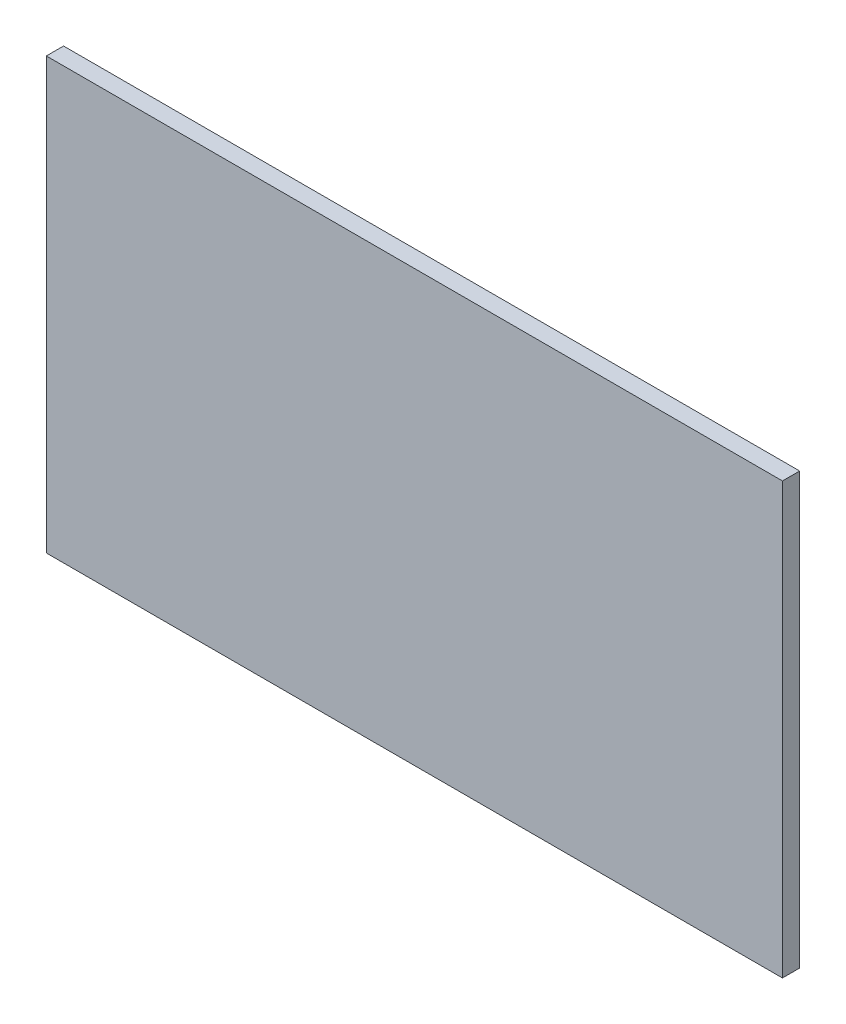
ISO-10303-21;
HEADER;
FILE_DESCRIPTION(('STEP AP214'),'2;1');
FILE_NAME('part.step','',(''),(''),'','','');
FILE_SCHEMA(('AUTOMOTIVE_DESIGN { 1 0 10303 214 1 1 1 1 }'));
ENDSEC;
DATA;
#1=APPLICATION_CONTEXT('core data for automotive mechanical design processes');
#2=APPLICATION_PROTOCOL_DEFINITION('international standard','automotive_design',2000,#1);
#3=PRODUCT_CONTEXT('',#1,'mechanical');
#4=PRODUCT('Part','Part','',(#3));
#5=PRODUCT_RELATED_PRODUCT_CATEGORY('part','',(#4));
#6=PRODUCT_DEFINITION_FORMATION('','',#4);
#7=PRODUCT_DEFINITION_CONTEXT('part definition',#1,'design');
#8=PRODUCT_DEFINITION('design','',#6,#7);
#9=PRODUCT_DEFINITION_SHAPE('','',#8);
#10=(LENGTH_UNIT() NAMED_UNIT(*) SI_UNIT(.MILLI.,.METRE.));
#11=(NAMED_UNIT(*) PLANE_ANGLE_UNIT() SI_UNIT($,.RADIAN.));
#12=(NAMED_UNIT(*) SI_UNIT($,.STERADIAN.) SOLID_ANGLE_UNIT());
#13=UNCERTAINTY_MEASURE_WITH_UNIT(LENGTH_MEASURE(1.E-05),#10,'distance_accuracy_value','');
#14=(GEOMETRIC_REPRESENTATION_CONTEXT(3) GLOBAL_UNCERTAINTY_ASSIGNED_CONTEXT((#13)) GLOBAL_UNIT_ASSIGNED_CONTEXT((#10,
#11,#12)) REPRESENTATION_CONTEXT('',''));
#15=CARTESIAN_POINT('',(0.,0.,0.));
#16=DIRECTION('',(0.,0.,1.));
#17=DIRECTION('',(1.,0.,0.));
#18=AXIS2_PLACEMENT_3D('',#15,#16,#17);
#19=CARTESIAN_POINT('',(-605.,499.999999999988,40.));
#20=DIRECTION('',(1.,0.,0.));
#21=DIRECTION('',(0.,1.,0.));
#22=AXIS2_PLACEMENT_3D('',#19,#20,#21);
#23=PLANE('',#22);
#24=DIRECTION('',(0.,-1.,0.));
#25=VECTOR('',#24,1.);
#26=CARTESIAN_POINT('',(-605.,499.999999999988,0.));
#27=LINE('',#26,#25);
#28=CARTESIAN_POINT('',(-605.,499.999999999988,0.));
#29=VERTEX_POINT('',#28);
#30=CARTESIAN_POINT('',(-605.,-500.,0.));
#31=VERTEX_POINT('',#30);
#32=EDGE_CURVE('E102',#29,#31,#27,.T.);
#33=ORIENTED_EDGE('',*,*,#32,.T.);
#34=DIRECTION('',(0.,0.,-1.));
#35=VECTOR('',#34,1.);
#36=CARTESIAN_POINT('',(-605.,-500.,40.));
#37=LINE('',#36,#35);
#38=CARTESIAN_POINT('',(-605.,-500.,40.));
#39=VERTEX_POINT('',#38);
#40=EDGE_CURVE('E11',#39,#31,#37,.T.);
#41=ORIENTED_EDGE('',*,*,#40,.F.);
#42=DIRECTION('',(0.,-1.,0.));
#43=VECTOR('',#42,1.);
#44=CARTESIAN_POINT('',(-605.,499.999999999988,40.));
#45=LINE('',#44,#43);
#46=CARTESIAN_POINT('',(-605.,499.999999999988,40.));
#47=VERTEX_POINT('',#46);
#48=EDGE_CURVE('E88',#47,#39,#45,.T.);
#49=ORIENTED_EDGE('',*,*,#48,.F.);
#50=DIRECTION('',(0.,0.,-1.));
#51=VECTOR('',#50,1.);
#52=CARTESIAN_POINT('',(-605.,499.999999999988,40.));
#53=LINE('',#52,#51);
#54=EDGE_CURVE('E55',#47,#29,#53,.T.);
#55=ORIENTED_EDGE('',*,*,#54,.T.);
#56=EDGE_LOOP('',(#33,#41,#49,#55));
#57=FACE_BOUND('',#56,.T.);
#58=ADVANCED_FACE('F39',(#57),#23,.F.);
#59=CARTESIAN_POINT('',(-605.,-500.,40.));
#60=DIRECTION('',(0.,1.,0.));
#61=DIRECTION('',(0.,0.,1.));
#62=AXIS2_PLACEMENT_3D('',#59,#60,#61);
#63=PLANE('',#62);
#64=DIRECTION('',(1.,0.,0.));
#65=VECTOR('',#64,1.);
#66=CARTESIAN_POINT('',(-605.,-500.,0.));
#67=LINE('',#66,#65);
#68=CARTESIAN_POINT('',(1105.,-500.,0.));
#69=VERTEX_POINT('',#68);
#70=EDGE_CURVE('E93',#31,#69,#67,.T.);
#71=ORIENTED_EDGE('',*,*,#70,.T.);
#72=DIRECTION('',(0.,0.,-1.));
#73=VECTOR('',#72,1.);
#74=CARTESIAN_POINT('',(1105.,-500.,40.));
#75=LINE('',#74,#73);
#76=CARTESIAN_POINT('',(1105.,-500.,40.));
#77=VERTEX_POINT('',#76);
#78=EDGE_CURVE('E47',#77,#69,#75,.T.);
#79=ORIENTED_EDGE('',*,*,#78,.F.);
#80=DIRECTION('',(1.,0.,0.));
#81=VECTOR('',#80,1.);
#82=CARTESIAN_POINT('',(-605.,-500.,40.));
#83=LINE('',#82,#81);
#84=EDGE_CURVE('E80',#39,#77,#83,.T.);
#85=ORIENTED_EDGE('',*,*,#84,.F.);
#86=ORIENTED_EDGE('',*,*,#40,.T.);
#87=EDGE_LOOP('',(#71,#79,#85,#86));
#88=FACE_BOUND('',#87,.T.);
#89=ADVANCED_FACE('F92',(#88),#63,.F.);
#90=CARTESIAN_POINT('',(1105.,499.999999999988,40.));
#91=DIRECTION('',(1.,0.,0.));
#92=DIRECTION('',(0.,1.,0.));
#93=AXIS2_PLACEMENT_3D('',#90,#91,#92);
#94=PLANE('',#93);
#95=DIRECTION('',(0.,-1.,0.));
#96=VECTOR('',#95,1.);
#97=CARTESIAN_POINT('',(1105.,499.999999999988,0.));
#98=LINE('',#97,#96);
#99=CARTESIAN_POINT('',(1105.,499.999999999988,0.));
#100=VERTEX_POINT('',#99);
#101=EDGE_CURVE('E105',#100,#69,#98,.T.);
#102=ORIENTED_EDGE('',*,*,#101,.F.);
#103=DIRECTION('',(0.,0.,-1.));
#104=VECTOR('',#103,1.);
#105=CARTESIAN_POINT('',(1105.,499.999999999988,40.));
#106=LINE('',#105,#104);
#107=CARTESIAN_POINT('',(1105.,499.999999999988,40.));
#108=VERTEX_POINT('',#107);
#109=EDGE_CURVE('E69',#108,#100,#106,.T.);
#110=ORIENTED_EDGE('',*,*,#109,.F.);
#111=DIRECTION('',(0.,-1.,0.));
#112=VECTOR('',#111,1.);
#113=CARTESIAN_POINT('',(1105.,499.999999999988,40.));
#114=LINE('',#113,#112);
#115=EDGE_CURVE('E87',#108,#77,#114,.T.);
#116=ORIENTED_EDGE('',*,*,#115,.T.);
#117=ORIENTED_EDGE('',*,*,#78,.T.);
#118=EDGE_LOOP('',(#102,#110,#116,#117));
#119=FACE_BOUND('',#118,.T.);
#120=ADVANCED_FACE('F96',(#119),#94,.T.);
#121=CARTESIAN_POINT('',(-605.,499.999999999988,40.));
#122=DIRECTION('',(0.,1.,0.));
#123=DIRECTION('',(0.,0.,1.));
#124=AXIS2_PLACEMENT_3D('',#121,#122,#123);
#125=PLANE('',#124);
#126=DIRECTION('',(1.,0.,0.));
#127=VECTOR('',#126,1.);
#128=CARTESIAN_POINT('',(-605.,499.999999999988,0.));
#129=LINE('',#128,#127);
#130=EDGE_CURVE('E107',#29,#100,#129,.T.);
#131=ORIENTED_EDGE('',*,*,#130,.F.);
#132=ORIENTED_EDGE('',*,*,#54,.F.);
#133=DIRECTION('',(1.,0.,0.));
#134=VECTOR('',#133,1.);
#135=CARTESIAN_POINT('',(-605.,499.999999999988,40.));
#136=LINE('',#135,#134);
#137=EDGE_CURVE('E97',#47,#108,#136,.T.);
#138=ORIENTED_EDGE('',*,*,#137,.T.);
#139=ORIENTED_EDGE('',*,*,#109,.T.);
#140=EDGE_LOOP('',(#131,#132,#138,#139));
#141=FACE_BOUND('',#140,.T.);
#142=ADVANCED_FACE('F113',(#141),#125,.T.);
#143=CARTESIAN_POINT('',(0.,0.,40.));
#144=DIRECTION('',(0.,0.,1.));
#145=DIRECTION('',(1.,0.,0.));
#146=AXIS2_PLACEMENT_3D('',#143,#144,#145);
#147=PLANE('',#146);
#148=ORIENTED_EDGE('',*,*,#48,.T.);
#149=ORIENTED_EDGE('',*,*,#84,.T.);
#150=ORIENTED_EDGE('',*,*,#115,.F.);
#151=ORIENTED_EDGE('',*,*,#137,.F.);
#152=EDGE_LOOP('',(#148,#149,#150,#151));
#153=FACE_BOUND('',#152,.T.);
#154=ADVANCED_FACE('F84',(#153),#147,.T.);
#155=CARTESIAN_POINT('',(0.,0.,0.));
#156=DIRECTION('',(0.,0.,1.));
#157=DIRECTION('',(1.,0.,0.));
#158=AXIS2_PLACEMENT_3D('',#155,#156,#157);
#159=PLANE('',#158);
#160=ORIENTED_EDGE('',*,*,#32,.F.);
#161=ORIENTED_EDGE('',*,*,#130,.T.);
#162=ORIENTED_EDGE('',*,*,#101,.T.);
#163=ORIENTED_EDGE('',*,*,#70,.F.);
#164=EDGE_LOOP('',(#160,#161,#162,#163));
#165=FACE_BOUND('',#164,.T.);
#166=ADVANCED_FACE('F112',(#165),#159,.F.);
#167=CLOSED_SHELL('',(#58,#89,#120,#142,#154,#166));
#168=MANIFOLD_SOLID_BREP('B2',#167);
#169=ADVANCED_BREP_SHAPE_REPRESENTATION('',(#18,#168),#14);
#170=SHAPE_DEFINITION_REPRESENTATION(#9,#169);
ENDSEC;
END-ISO-10303-21;
